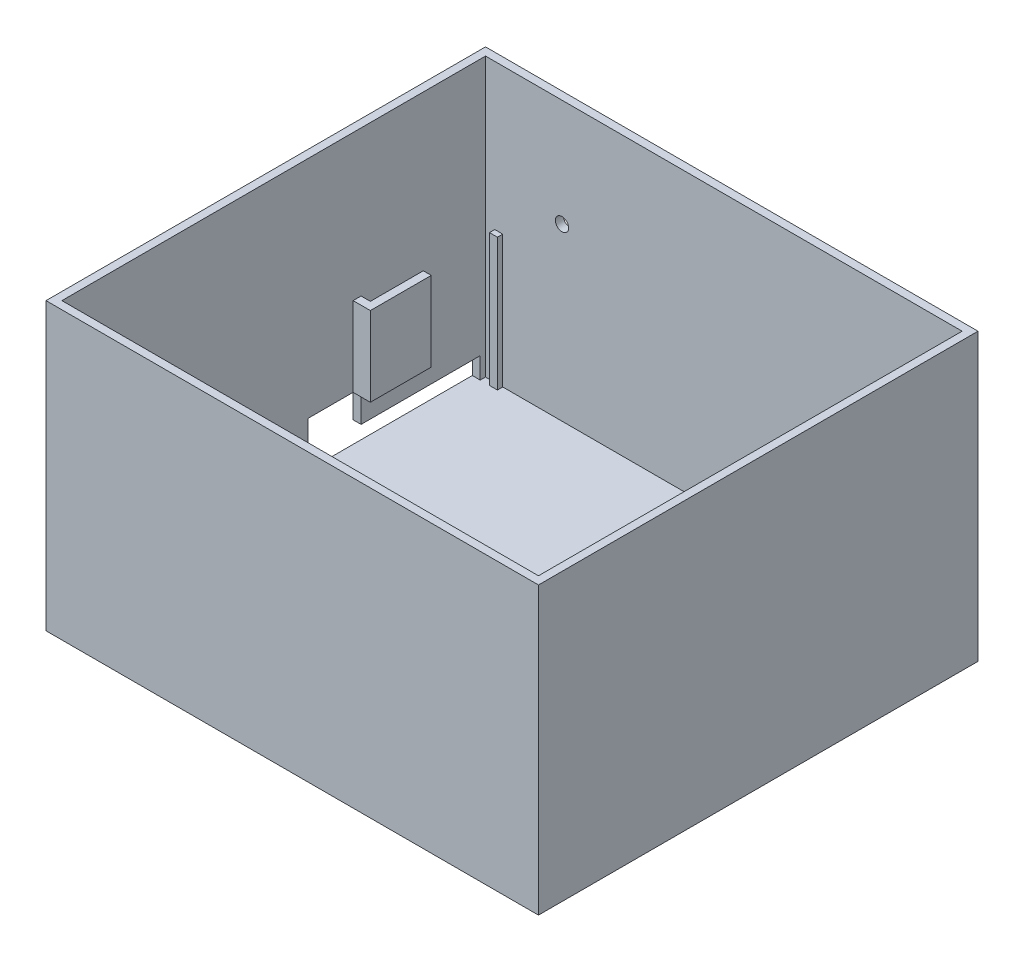
ISO-10303-21;
HEADER;
FILE_DESCRIPTION(('STEP AP214'),'2;1');
FILE_NAME('part.step','',(''),(''),'','','');
FILE_SCHEMA(('AUTOMOTIVE_DESIGN { 1 0 10303 214 1 1 1 1 }'));
ENDSEC;
DATA;
#1=APPLICATION_CONTEXT('core data for automotive mechanical design processes');
#2=APPLICATION_PROTOCOL_DEFINITION('international standard','automotive_design',2000,#1);
#3=PRODUCT_CONTEXT('',#1,'mechanical');
#4=PRODUCT('Part','Part','',(#3));
#5=PRODUCT_RELATED_PRODUCT_CATEGORY('part','',(#4));
#6=PRODUCT_DEFINITION_FORMATION('','',#4);
#7=PRODUCT_DEFINITION_CONTEXT('part definition',#1,'design');
#8=PRODUCT_DEFINITION('design','',#6,#7);
#9=PRODUCT_DEFINITION_SHAPE('','',#8);
#10=(LENGTH_UNIT() NAMED_UNIT(*) SI_UNIT(.MILLI.,.METRE.));
#11=(NAMED_UNIT(*) PLANE_ANGLE_UNIT() SI_UNIT($,.RADIAN.));
#12=(NAMED_UNIT(*) SI_UNIT($,.STERADIAN.) SOLID_ANGLE_UNIT());
#13=UNCERTAINTY_MEASURE_WITH_UNIT(LENGTH_MEASURE(1.E-05),#10,'distance_accuracy_value','');
#14=(GEOMETRIC_REPRESENTATION_CONTEXT(3) GLOBAL_UNCERTAINTY_ASSIGNED_CONTEXT((#13)) GLOBAL_UNIT_ASSIGNED_CONTEXT((#10,
#11,#12)) REPRESENTATION_CONTEXT('',''));
#15=CARTESIAN_POINT('',(0.,0.,0.));
#16=DIRECTION('',(0.,0.,1.));
#17=DIRECTION('',(1.,0.,0.));
#18=AXIS2_PLACEMENT_3D('',#15,#16,#17);
#19=CARTESIAN_POINT('',(-79.75,23.,-2.875));
#20=DIRECTION('',(0.,0.,1.));
#21=DIRECTION('',(1.,0.,0.));
#22=AXIS2_PLACEMENT_3D('',#19,#20,#21);
#23=PLANE('',#22);
#24=DIRECTION('',(0.,1.,0.));
#25=VECTOR('',#24,1.);
#26=CARTESIAN_POINT('',(-82.75,23.,-2.875));
#27=LINE('',#26,#25);
#28=CARTESIAN_POINT('',(-82.75,23.,-2.875));
#29=VERTEX_POINT('',#28);
#30=CARTESIAN_POINT('',(-82.75,53.,-2.875));
#31=VERTEX_POINT('',#30);
#32=EDGE_CURVE('E243',#29,#31,#27,.T.);
#33=ORIENTED_EDGE('',*,*,#32,.F.);
#34=DIRECTION('',(-1.,0.,0.));
#35=VECTOR('',#34,1.);
#36=CARTESIAN_POINT('',(-79.75,23.,-2.875));
#37=LINE('',#36,#35);
#38=CARTESIAN_POINT('',(-86.25,23.,-2.875));
#39=VERTEX_POINT('',#38);
#40=EDGE_CURVE('E266',#29,#39,#37,.T.);
#41=ORIENTED_EDGE('',*,*,#40,.T.);
#42=DIRECTION('',(0.,1.,0.));
#43=VECTOR('',#42,1.);
#44=CARTESIAN_POINT('',(-86.25,23.,-2.875));
#45=LINE('',#44,#43);
#46=CARTESIAN_POINT('',(-86.25,53.,-2.875));
#47=VERTEX_POINT('',#46);
#48=EDGE_CURVE('E248',#39,#47,#45,.T.);
#49=ORIENTED_EDGE('',*,*,#48,.T.);
#50=DIRECTION('',(-1.,0.,0.));
#51=VECTOR('',#50,1.);
#52=CARTESIAN_POINT('',(-79.75,53.,-2.875));
#53=LINE('',#52,#51);
#54=EDGE_CURVE('E56',#31,#47,#53,.T.);
#55=ORIENTED_EDGE('',*,*,#54,.F.);
#56=EDGE_LOOP('',(#33,#41,#49,#55));
#57=FACE_BOUND('',#56,.T.);
#58=ADVANCED_FACE('F39',(#57),#23,.F.);
#59=CARTESIAN_POINT('',(-86.25,108.,-49.875));
#60=DIRECTION('',(-1.,0.,0.));
#61=DIRECTION('',(0.,0.,1.));
#62=AXIS2_PLACEMENT_3D('',#59,#60,#61);
#63=PLANE('',#62);
#64=ORIENTED_EDGE('',*,*,#48,.F.);
#65=DIRECTION('',(0.,-1.,0.));
#66=VECTOR('',#65,1.);
#67=CARTESIAN_POINT('',(-86.25,2.99999999999999,-2.875));
#68=LINE('',#67,#66);
#69=CARTESIAN_POINT('',(-86.25,11.,-2.875));
#70=VERTEX_POINT('',#69);
#71=EDGE_CURVE('E285',#39,#70,#68,.T.);
#72=ORIENTED_EDGE('',*,*,#71,.T.);
#73=DIRECTION('',(0.,0.,1.));
#74=VECTOR('',#73,1.);
#75=CARTESIAN_POINT('',(-86.25,11.,-47.875));
#76=LINE('',#75,#74);
#77=CARTESIAN_POINT('',(-86.25,11.,-47.875));
#78=VERTEX_POINT('',#77);
#79=EDGE_CURVE('E360',#78,#70,#76,.T.);
#80=ORIENTED_EDGE('',*,*,#79,.F.);
#81=DIRECTION('',(0.,1.,0.));
#82=VECTOR('',#81,1.);
#83=CARTESIAN_POINT('',(-86.25,3.,-47.875));
#84=LINE('',#83,#82);
#85=CARTESIAN_POINT('',(-86.25,3.,-47.875));
#86=VERTEX_POINT('',#85);
#87=EDGE_CURVE('E354',#86,#78,#84,.T.);
#88=ORIENTED_EDGE('',*,*,#87,.F.);
#89=DIRECTION('',(0.,0.,-1.));
#90=VECTOR('',#89,1.);
#91=CARTESIAN_POINT('',(-86.25,3.,-49.875));
#92=LINE('',#91,#90);
#93=CARTESIAN_POINT('',(-86.25,3.,-49.875));
#94=VERTEX_POINT('',#93);
#95=EDGE_CURVE('E417',#86,#94,#92,.T.);
#96=ORIENTED_EDGE('',*,*,#95,.T.);
#97=DIRECTION('',(0.,-1.,0.));
#98=VECTOR('',#97,1.);
#99=CARTESIAN_POINT('',(-86.25,108.,-49.875));
#100=LINE('',#99,#98);
#101=CARTESIAN_POINT('',(-86.25,108.,-49.875));
#102=VERTEX_POINT('',#101);
#103=EDGE_CURVE('E422',#102,#94,#100,.T.);
#104=ORIENTED_EDGE('',*,*,#103,.F.);
#105=DIRECTION('',(0.,0.,-1.));
#106=VECTOR('',#105,1.);
#107=CARTESIAN_POINT('',(-86.25,108.,-49.875));
#108=LINE('',#107,#106);
#109=CARTESIAN_POINT('',(-86.25,108.,110.125));
#110=VERTEX_POINT('',#109);
#111=EDGE_CURVE('E418',#110,#102,#108,.T.);
#112=ORIENTED_EDGE('',*,*,#111,.F.);
#113=DIRECTION('',(0.,-1.,0.));
#114=VECTOR('',#113,1.);
#115=CARTESIAN_POINT('',(-86.25,108.,110.125));
#116=LINE('',#115,#114);
#117=CARTESIAN_POINT('',(-86.25,3.,110.125));
#118=VERTEX_POINT('',#117);
#119=EDGE_CURVE('E431',#110,#118,#116,.T.);
#120=ORIENTED_EDGE('',*,*,#119,.T.);
#121=CARTESIAN_POINT('',(-86.25,3.,54.125));
#122=VERTEX_POINT('',#121);
#123=EDGE_CURVE('E423',#118,#122,#92,.T.);
#124=ORIENTED_EDGE('',*,*,#123,.T.);
#125=DIRECTION('',(0.,-1.,0.));
#126=VECTOR('',#125,1.);
#127=CARTESIAN_POINT('',(-86.25,23.,54.125));
#128=LINE('',#127,#126);
#129=CARTESIAN_POINT('',(-86.25,23.,54.125));
#130=VERTEX_POINT('',#129);
#131=EDGE_CURVE('E414',#130,#122,#128,.T.);
#132=ORIENTED_EDGE('',*,*,#131,.F.);
#133=DIRECTION('',(0.,0.,1.));
#134=VECTOR('',#133,1.);
#135=CARTESIAN_POINT('',(-86.25,23.,51.125));
#136=LINE('',#135,#134);
#137=CARTESIAN_POINT('',(-86.25,23.,51.125));
#138=VERTEX_POINT('',#137);
#139=EDGE_CURVE('E384',#138,#130,#136,.T.);
#140=ORIENTED_EDGE('',*,*,#139,.F.);
#141=DIRECTION('',(0.,-1.,0.));
#142=VECTOR('',#141,1.);
#143=CARTESIAN_POINT('',(-86.25,23.,51.125));
#144=LINE('',#143,#142);
#145=CARTESIAN_POINT('',(-86.25,3.,51.125));
#146=VERTEX_POINT('',#145);
#147=EDGE_CURVE('E399',#138,#146,#144,.T.);
#148=ORIENTED_EDGE('',*,*,#147,.T.);
#149=CARTESIAN_POINT('',(-86.25,2.99999999999999,17.125));
#150=VERTEX_POINT('',#149);
#151=EDGE_CURVE('E427',#146,#150,#92,.T.);
#152=ORIENTED_EDGE('',*,*,#151,.T.);
#153=DIRECTION('',(0.,1.,0.));
#154=VECTOR('',#153,1.);
#155=CARTESIAN_POINT('',(-86.25,2.99999999999999,17.125));
#156=LINE('',#155,#154);
#157=CARTESIAN_POINT('',(-86.25,23.,17.125));
#158=VERTEX_POINT('',#157);
#159=EDGE_CURVE('E289',#150,#158,#156,.T.);
#160=ORIENTED_EDGE('',*,*,#159,.T.);
#161=DIRECTION('',(0.,0.,-1.));
#162=VECTOR('',#161,1.);
#163=CARTESIAN_POINT('',(-86.25,23.,-2.875));
#164=LINE('',#163,#162);
#165=CARTESIAN_POINT('',(-86.25,23.,0.124999999999998));
#166=VERTEX_POINT('',#165);
#167=EDGE_CURVE('E294',#158,#166,#164,.T.);
#168=ORIENTED_EDGE('',*,*,#167,.T.);
#169=DIRECTION('',(0.,-1.,0.));
#170=VECTOR('',#169,1.);
#171=CARTESIAN_POINT('',(-86.25,23.,0.124999999999998));
#172=LINE('',#171,#170);
#173=CARTESIAN_POINT('',(-86.25,53.,0.125));
#174=VERTEX_POINT('',#173);
#175=EDGE_CURVE('E63',#174,#166,#172,.T.);
#176=ORIENTED_EDGE('',*,*,#175,.F.);
#177=DIRECTION('',(0.,0.,1.));
#178=VECTOR('',#177,1.);
#179=CARTESIAN_POINT('',(-86.25,53.,-2.875));
#180=LINE('',#179,#178);
#181=EDGE_CURVE('E254',#47,#174,#180,.T.);
#182=ORIENTED_EDGE('',*,*,#181,.F.);
#183=EDGE_LOOP('',(#64,#72,#80,#88,#96,#104,#112,#120,#124,#132,#140,#148,#152,#160,#168,#176,#182));
#184=FACE_BOUND('',#183,.T.);
#185=ADVANCED_FACE('F532',(#184),#63,.F.);
#186=CARTESIAN_POINT('',(0.,3.,0.));
#187=DIRECTION('',(0.,1.,0.));
#188=DIRECTION('',(0.,0.,1.));
#189=AXIS2_PLACEMENT_3D('',#186,#187,#188);
#190=PLANE('',#189);
#191=DIRECTION('',(-1.,0.,0.));
#192=VECTOR('',#191,1.);
#193=CARTESIAN_POINT('',(-86.25,2.99999999999999,17.125));
#194=LINE('',#193,#192);
#195=CARTESIAN_POINT('',(-89.25,2.99999999999999,17.125));
#196=VERTEX_POINT('',#195);
#197=EDGE_CURVE('E297',#150,#196,#194,.T.);
#198=ORIENTED_EDGE('',*,*,#197,.F.);
#199=ORIENTED_EDGE('',*,*,#151,.F.);
#200=DIRECTION('',(-1.,0.,0.));
#201=VECTOR('',#200,1.);
#202=CARTESIAN_POINT('',(-86.25,3.,51.125));
#203=LINE('',#202,#201);
#204=CARTESIAN_POINT('',(93.7499999999999,3.,51.125));
#205=VERTEX_POINT('',#204);
#206=EDGE_CURVE('E389',#205,#146,#203,.T.);
#207=ORIENTED_EDGE('',*,*,#206,.F.);
#208=DIRECTION('',(0.,0.,1.));
#209=VECTOR('',#208,1.);
#210=CARTESIAN_POINT('',(93.75,3.,-49.875));
#211=LINE('',#210,#209);
#212=CARTESIAN_POINT('',(93.7499999999999,3.,-49.875));
#213=VERTEX_POINT('',#212);
#214=EDGE_CURVE('E452',#213,#205,#211,.T.);
#215=ORIENTED_EDGE('',*,*,#214,.F.);
#216=DIRECTION('',(1.,0.,0.));
#217=VECTOR('',#216,1.);
#218=CARTESIAN_POINT('',(-89.25,3.,-49.875));
#219=LINE('',#218,#217);
#220=CARTESIAN_POINT('',(-79.75,3.,-49.875));
#221=VERTEX_POINT('',#220);
#222=EDGE_CURVE('E434',#221,#213,#219,.T.);
#223=ORIENTED_EDGE('',*,*,#222,.F.);
#224=DIRECTION('',(0.,0.,-1.));
#225=VECTOR('',#224,1.);
#226=CARTESIAN_POINT('',(-79.75,3.,-49.875));
#227=LINE('',#226,#225);
#228=CARTESIAN_POINT('',(-79.75,3.,-47.875));
#229=VERTEX_POINT('',#228);
#230=EDGE_CURVE('E322',#229,#221,#227,.T.);
#231=ORIENTED_EDGE('',*,*,#230,.F.);
#232=DIRECTION('',(1.,0.,0.));
#233=VECTOR('',#232,1.);
#234=CARTESIAN_POINT('',(-82.75,3.,-47.875));
#235=LINE('',#234,#233);
#236=CARTESIAN_POINT('',(-82.75,3.,-47.875));
#237=VERTEX_POINT('',#236);
#238=EDGE_CURVE('E336',#237,#229,#235,.T.);
#239=ORIENTED_EDGE('',*,*,#238,.F.);
#240=DIRECTION('',(0.,0.,1.));
#241=VECTOR('',#240,1.);
#242=CARTESIAN_POINT('',(-82.75,3.,-49.875));
#243=LINE('',#242,#241);
#244=CARTESIAN_POINT('',(-82.75,3.,-49.875));
#245=VERTEX_POINT('',#244);
#246=EDGE_CURVE('E310',#245,#237,#243,.T.);
#247=ORIENTED_EDGE('',*,*,#246,.F.);
#248=EDGE_CURVE('E439',#94,#245,#219,.T.);
#249=ORIENTED_EDGE('',*,*,#248,.F.);
#250=ORIENTED_EDGE('',*,*,#95,.F.);
#251=DIRECTION('',(1.,0.,0.));
#252=VECTOR('',#251,1.);
#253=CARTESIAN_POINT('',(-89.25,3.,-47.875));
#254=LINE('',#253,#252);
#255=CARTESIAN_POINT('',(-89.25,3.,-47.875));
#256=VERTEX_POINT('',#255);
#257=EDGE_CURVE('E374',#256,#86,#254,.T.);
#258=ORIENTED_EDGE('',*,*,#257,.F.);
#259=DIRECTION('',(0.,0.,-1.));
#260=VECTOR('',#259,1.);
#261=CARTESIAN_POINT('',(-89.25,3.,-47.875));
#262=LINE('',#261,#260);
#263=EDGE_CURVE('E364',#196,#256,#262,.T.);
#264=ORIENTED_EDGE('',*,*,#263,.F.);
#265=EDGE_LOOP('',(#198,#199,#207,#215,#223,#231,#239,#247,#249,#250,#258,#264));
#266=FACE_BOUND('',#265,.T.);
#267=ADVANCED_FACE('F538',(#266),#190,.T.);
#268=CARTESIAN_POINT('',(-89.25,108.,-49.875));
#269=DIRECTION('',(0.,0.,-1.));
#270=DIRECTION('',(-1.,0.,0.));
#271=AXIS2_PLACEMENT_3D('',#268,#269,#270);
#272=PLANE('',#271);
#273=CARTESIAN_POINT('',(-57.3658746621959,67.44295955,-49.875));
#274=DIRECTION('',(0.,0.,1.));
#275=DIRECTION('',(1.,0.,0.));
#276=AXIS2_PLACEMENT_3D('',#273,#274,#275);
#277=CIRCLE('',#276,2.5);
#278=CARTESIAN_POINT('',(-54.8658746621959,67.44295955,-49.875));
#279=VERTEX_POINT('',#278);
#280=EDGE_CURVE('E619',#279,#279,#277,.T.);
#281=ORIENTED_EDGE('',*,*,#280,.F.);
#282=EDGE_LOOP('',(#281));
#283=FACE_BOUND('',#282,.T.);
#284=DIRECTION('',(0.,-1.,0.));
#285=VECTOR('',#284,1.);
#286=CARTESIAN_POINT('',(-82.75,53.,-49.875));
#287=LINE('',#286,#285);
#288=CARTESIAN_POINT('',(-82.75,53.,-49.875));
#289=VERTEX_POINT('',#288);
#290=EDGE_CURVE('E332',#289,#245,#287,.T.);
#291=ORIENTED_EDGE('',*,*,#290,.F.);
#292=DIRECTION('',(-1.,0.,0.));
#293=VECTOR('',#292,1.);
#294=CARTESIAN_POINT('',(-82.75,53.,-49.875));
#295=LINE('',#294,#293);
#296=CARTESIAN_POINT('',(-79.75,53.,-49.875));
#297=VERTEX_POINT('',#296);
#298=EDGE_CURVE('E329',#297,#289,#295,.T.);
#299=ORIENTED_EDGE('',*,*,#298,.F.);
#300=DIRECTION('',(0.,-1.,0.));
#301=VECTOR('',#300,1.);
#302=CARTESIAN_POINT('',(-79.75,53.,-49.875));
#303=LINE('',#302,#301);
#304=EDGE_CURVE('E343',#297,#221,#303,.T.);
#305=ORIENTED_EDGE('',*,*,#304,.T.);
#306=ORIENTED_EDGE('',*,*,#222,.T.);
#307=DIRECTION('',(0.,-1.,0.));
#308=VECTOR('',#307,1.);
#309=CARTESIAN_POINT('',(93.75,108.,-49.875));
#310=LINE('',#309,#308);
#311=CARTESIAN_POINT('',(93.75,108.,-49.875));
#312=VERTEX_POINT('',#311);
#313=EDGE_CURVE('E455',#312,#213,#310,.T.);
#314=ORIENTED_EDGE('',*,*,#313,.F.);
#315=DIRECTION('',(1.,0.,0.));
#316=VECTOR('',#315,1.);
#317=CARTESIAN_POINT('',(-89.25,108.,-49.875));
#318=LINE('',#317,#316);
#319=EDGE_CURVE('E435',#102,#312,#318,.T.);
#320=ORIENTED_EDGE('',*,*,#319,.F.);
#321=ORIENTED_EDGE('',*,*,#103,.T.);
#322=ORIENTED_EDGE('',*,*,#248,.T.);
#323=EDGE_LOOP('',(#291,#299,#305,#306,#314,#320,#321,#322));
#324=FACE_BOUND('',#323,.T.);
#325=ADVANCED_FACE('F591',(#283,#324),#272,.F.);
#326=CARTESIAN_POINT('',(93.7499999999999,3.,54.125));
#327=VERTEX_POINT('',#326);
#328=CARTESIAN_POINT('',(93.75,3.,110.125));
#329=VERTEX_POINT('',#328);
#330=EDGE_CURVE('E443',#327,#329,#211,.T.);
#331=ORIENTED_EDGE('',*,*,#330,.F.);
#332=DIRECTION('',(1.,0.,0.));
#333=VECTOR('',#332,1.);
#334=CARTESIAN_POINT('',(-86.25,3.,54.125));
#335=LINE('',#334,#333);
#336=EDGE_CURVE('E377',#122,#327,#335,.T.);
#337=ORIENTED_EDGE('',*,*,#336,.F.);
#338=ORIENTED_EDGE('',*,*,#123,.F.);
#339=DIRECTION('',(-1.,0.,0.));
#340=VECTOR('',#339,1.);
#341=CARTESIAN_POINT('',(-89.25,3.,110.125));
#342=LINE('',#341,#340);
#343=EDGE_CURVE('E462',#329,#118,#342,.T.);
#344=ORIENTED_EDGE('',*,*,#343,.F.);
#345=EDGE_LOOP('',(#331,#337,#338,#344));
#346=FACE_BOUND('',#345,.T.);
#347=ADVANCED_FACE('F594',(#346),#190,.T.);
#348=CARTESIAN_POINT('',(93.75,108.,-49.875));
#349=DIRECTION('',(1.,0.,0.));
#350=DIRECTION('',(0.,0.,-1.));
#351=AXIS2_PLACEMENT_3D('',#348,#349,#350);
#352=PLANE('',#351);
#353=DIRECTION('',(0.,-1.,0.));
#354=VECTOR('',#353,1.);
#355=CARTESIAN_POINT('',(93.7499999999999,23.,54.125));
#356=LINE('',#355,#354);
#357=CARTESIAN_POINT('',(93.7499999999999,23.,54.125));
#358=VERTEX_POINT('',#357);
#359=EDGE_CURVE('E410',#358,#327,#356,.T.);
#360=ORIENTED_EDGE('',*,*,#359,.T.);
#361=ORIENTED_EDGE('',*,*,#330,.T.);
#362=DIRECTION('',(0.,-1.,0.));
#363=VECTOR('',#362,1.);
#364=CARTESIAN_POINT('',(93.75,108.,110.125));
#365=LINE('',#364,#363);
#366=CARTESIAN_POINT('',(93.75,108.,110.125));
#367=VERTEX_POINT('',#366);
#368=EDGE_CURVE('E475',#367,#329,#365,.T.);
#369=ORIENTED_EDGE('',*,*,#368,.F.);
#370=DIRECTION('',(0.,0.,1.));
#371=VECTOR('',#370,1.);
#372=CARTESIAN_POINT('',(93.75,108.,-49.875));
#373=LINE('',#372,#371);
#374=EDGE_CURVE('E451',#312,#367,#373,.T.);
#375=ORIENTED_EDGE('',*,*,#374,.F.);
#376=ORIENTED_EDGE('',*,*,#313,.T.);
#377=ORIENTED_EDGE('',*,*,#214,.T.);
#378=DIRECTION('',(0.,-1.,0.));
#379=VECTOR('',#378,1.);
#380=CARTESIAN_POINT('',(93.7499999999999,23.,51.125));
#381=LINE('',#380,#379);
#382=CARTESIAN_POINT('',(93.7499999999999,23.,51.125));
#383=VERTEX_POINT('',#382);
#384=EDGE_CURVE('E407',#383,#205,#381,.T.);
#385=ORIENTED_EDGE('',*,*,#384,.F.);
#386=DIRECTION('',(0.,0.,-1.));
#387=VECTOR('',#386,1.);
#388=CARTESIAN_POINT('',(93.7499999999999,23.,51.125));
#389=LINE('',#388,#387);
#390=EDGE_CURVE('E392',#358,#383,#389,.T.);
#391=ORIENTED_EDGE('',*,*,#390,.F.);
#392=EDGE_LOOP('',(#360,#361,#369,#375,#376,#377,#385,#391));
#393=FACE_BOUND('',#392,.T.);
#394=ADVANCED_FACE('F596',(#393),#352,.F.);
#395=CARTESIAN_POINT('',(-89.25,108.,110.125));
#396=DIRECTION('',(0.,0.,1.));
#397=DIRECTION('',(1.,0.,0.));
#398=AXIS2_PLACEMENT_3D('',#395,#396,#397);
#399=PLANE('',#398);
#400=ORIENTED_EDGE('',*,*,#119,.F.);
#401=DIRECTION('',(-1.,0.,0.));
#402=VECTOR('',#401,1.);
#403=CARTESIAN_POINT('',(-89.25,108.,110.125));
#404=LINE('',#403,#402);
#405=EDGE_CURVE('E471',#367,#110,#404,.T.);
#406=ORIENTED_EDGE('',*,*,#405,.F.);
#407=ORIENTED_EDGE('',*,*,#368,.T.);
#408=ORIENTED_EDGE('',*,*,#343,.T.);
#409=EDGE_LOOP('',(#400,#406,#407,#408));
#410=FACE_BOUND('',#409,.T.);
#411=ADVANCED_FACE('F529',(#410),#399,.F.);
#412=CARTESIAN_POINT('',(-89.25,3.,-52.875));
#413=DIRECTION('',(1.,0.,0.));
#414=DIRECTION('',(0.,0.,-1.));
#415=AXIS2_PLACEMENT_3D('',#412,#413,#414);
#416=PLANE('',#415);
#417=DIRECTION('',(0.,0.,1.));
#418=VECTOR('',#417,1.);
#419=CARTESIAN_POINT('',(-89.25,11.,-47.875));
#420=LINE('',#419,#418);
#421=CARTESIAN_POINT('',(-89.25,11.,-47.875));
#422=VERTEX_POINT('',#421);
#423=CARTESIAN_POINT('',(-89.25,11.,-2.875));
#424=VERTEX_POINT('',#423);
#425=EDGE_CURVE('E359',#422,#424,#420,.T.);
#426=ORIENTED_EDGE('',*,*,#425,.T.);
#427=DIRECTION('',(0.,-1.,0.));
#428=VECTOR('',#427,1.);
#429=CARTESIAN_POINT('',(-89.25,2.99999999999999,-2.875));
#430=LINE('',#429,#428);
#431=CARTESIAN_POINT('',(-89.25,23.,-2.875));
#432=VERTEX_POINT('',#431);
#433=EDGE_CURVE('E284',#432,#424,#430,.T.);
#434=ORIENTED_EDGE('',*,*,#433,.F.);
#435=DIRECTION('',(0.,0.,-1.));
#436=VECTOR('',#435,1.);
#437=CARTESIAN_POINT('',(-89.25,23.,-2.875));
#438=LINE('',#437,#436);
#439=CARTESIAN_POINT('',(-89.25,23.,17.125));
#440=VERTEX_POINT('',#439);
#441=EDGE_CURVE('E290',#440,#432,#438,.T.);
#442=ORIENTED_EDGE('',*,*,#441,.F.);
#443=DIRECTION('',(0.,1.,0.));
#444=VECTOR('',#443,1.);
#445=CARTESIAN_POINT('',(-89.25,2.99999999999999,17.125));
#446=LINE('',#445,#444);
#447=EDGE_CURVE('E300',#196,#440,#446,.T.);
#448=ORIENTED_EDGE('',*,*,#447,.F.);
#449=ORIENTED_EDGE('',*,*,#263,.T.);
#450=DIRECTION('',(0.,1.,0.));
#451=VECTOR('',#450,1.);
#452=CARTESIAN_POINT('',(-89.25,3.,-47.875));
#453=LINE('',#452,#451);
#454=EDGE_CURVE('E355',#256,#422,#453,.T.);
#455=ORIENTED_EDGE('',*,*,#454,.T.);
#456=EDGE_LOOP('',(#426,#434,#442,#448,#449,#455));
#457=FACE_BOUND('',#456,.T.);
#458=DIRECTION('',(0.,0.,1.));
#459=VECTOR('',#458,1.);
#460=CARTESIAN_POINT('',(-89.25,0.,-52.875));
#461=LINE('',#460,#459);
#462=CARTESIAN_POINT('',(-89.25,0.,-52.875));
#463=VERTEX_POINT('',#462);
#464=CARTESIAN_POINT('',(-89.25,0.,113.125));
#465=VERTEX_POINT('',#464);
#466=EDGE_CURVE('E482',#463,#465,#461,.T.);
#467=ORIENTED_EDGE('',*,*,#466,.T.);
#468=DIRECTION('',(0.,-1.,0.));
#469=VECTOR('',#468,1.);
#470=CARTESIAN_POINT('',(-89.25,3.,113.125));
#471=LINE('',#470,#469);
#472=CARTESIAN_POINT('',(-89.25,108.,113.125));
#473=VERTEX_POINT('',#472);
#474=EDGE_CURVE('E11',#473,#465,#471,.T.);
#475=ORIENTED_EDGE('',*,*,#474,.F.);
#476=DIRECTION('',(0.,0.,1.));
#477=VECTOR('',#476,1.);
#478=CARTESIAN_POINT('',(-89.25,108.,110.125));
#479=LINE('',#478,#477);
#480=CARTESIAN_POINT('',(-89.25,108.,-52.875));
#481=VERTEX_POINT('',#480);
#482=EDGE_CURVE('E463',#481,#473,#479,.T.);
#483=ORIENTED_EDGE('',*,*,#482,.F.);
#484=DIRECTION('',(0.,-1.,0.));
#485=VECTOR('',#484,1.);
#486=CARTESIAN_POINT('',(-89.25,3.,-52.875));
#487=LINE('',#486,#485);
#488=EDGE_CURVE('E495',#481,#463,#487,.T.);
#489=ORIENTED_EDGE('',*,*,#488,.T.);
#490=EDGE_LOOP('',(#467,#475,#483,#489));
#491=FACE_BOUND('',#490,.T.);
#492=ADVANCED_FACE('F41',(#457,#491),#416,.F.);
#493=CARTESIAN_POINT('',(-89.25,3.,113.125));
#494=DIRECTION('',(0.,0.,-1.));
#495=DIRECTION('',(-1.,0.,0.));
#496=AXIS2_PLACEMENT_3D('',#493,#494,#495);
#497=PLANE('',#496);
#498=DIRECTION('',(0.,-1.,0.));
#499=VECTOR('',#498,1.);
#500=CARTESIAN_POINT('',(96.75,3.,113.125));
#501=LINE('',#500,#499);
#502=CARTESIAN_POINT('',(96.75,108.,113.125));
#503=VERTEX_POINT('',#502);
#504=CARTESIAN_POINT('',(96.75,0.,113.125));
#505=VERTEX_POINT('',#504);
#506=EDGE_CURVE('E49',#503,#505,#501,.T.);
#507=ORIENTED_EDGE('',*,*,#506,.F.);
#508=DIRECTION('',(1.,0.,0.));
#509=VECTOR('',#508,1.);
#510=CARTESIAN_POINT('',(-89.25,108.,113.125));
#511=LINE('',#510,#509);
#512=EDGE_CURVE('E467',#473,#503,#511,.T.);
#513=ORIENTED_EDGE('',*,*,#512,.F.);
#514=ORIENTED_EDGE('',*,*,#474,.T.);
#515=DIRECTION('',(1.,0.,0.));
#516=VECTOR('',#515,1.);
#517=CARTESIAN_POINT('',(-89.25,0.,113.125));
#518=LINE('',#517,#516);
#519=EDGE_CURVE('E486',#465,#505,#518,.T.);
#520=ORIENTED_EDGE('',*,*,#519,.T.);
#521=EDGE_LOOP('',(#507,#513,#514,#520));
#522=FACE_BOUND('',#521,.T.);
#523=ADVANCED_FACE('F522',(#522),#497,.F.);
#524=CARTESIAN_POINT('',(96.75,3.,-52.875));
#525=DIRECTION('',(-1.,0.,0.));
#526=DIRECTION('',(0.,0.,1.));
#527=AXIS2_PLACEMENT_3D('',#524,#525,#526);
#528=PLANE('',#527);
#529=DIRECTION('',(0.,-1.,0.));
#530=VECTOR('',#529,1.);
#531=CARTESIAN_POINT('',(96.75,3.,-52.875));
#532=LINE('',#531,#530);
#533=CARTESIAN_POINT('',(96.75,108.,-52.875));
#534=VERTEX_POINT('',#533);
#535=CARTESIAN_POINT('',(96.75,0.,-52.875));
#536=VERTEX_POINT('',#535);
#537=EDGE_CURVE('E499',#534,#536,#532,.T.);
#538=ORIENTED_EDGE('',*,*,#537,.F.);
#539=DIRECTION('',(0.,0.,-1.));
#540=VECTOR('',#539,1.);
#541=CARTESIAN_POINT('',(96.75,108.,-49.875));
#542=LINE('',#541,#540);
#543=EDGE_CURVE('E447',#503,#534,#542,.T.);
#544=ORIENTED_EDGE('',*,*,#543,.F.);
#545=ORIENTED_EDGE('',*,*,#506,.T.);
#546=DIRECTION('',(0.,0.,-1.));
#547=VECTOR('',#546,1.);
#548=CARTESIAN_POINT('',(96.75,0.,-52.875));
#549=LINE('',#548,#547);
#550=EDGE_CURVE('E489',#505,#536,#549,.T.);
#551=ORIENTED_EDGE('',*,*,#550,.T.);
#552=EDGE_LOOP('',(#538,#544,#545,#551));
#553=FACE_BOUND('',#552,.T.);
#554=ADVANCED_FACE('F508',(#553),#528,.F.);
#555=CARTESIAN_POINT('',(-89.25,3.,-52.875));
#556=DIRECTION('',(0.,0.,1.));
#557=DIRECTION('',(1.,0.,0.));
#558=AXIS2_PLACEMENT_3D('',#555,#556,#557);
#559=PLANE('',#558);
#560=CARTESIAN_POINT('',(-57.3658746621959,67.44295955,-52.875));
#561=DIRECTION('',(0.,0.,1.));
#562=DIRECTION('',(1.,0.,0.));
#563=AXIS2_PLACEMENT_3D('',#560,#561,#562);
#564=CIRCLE('',#563,2.5);
#565=CARTESIAN_POINT('',(-54.8658746621959,67.44295955,-52.875));
#566=VERTEX_POINT('',#565);
#567=EDGE_CURVE('E43',#566,#566,#564,.T.);
#568=ORIENTED_EDGE('',*,*,#567,.T.);
#569=EDGE_LOOP('',(#568));
#570=FACE_BOUND('',#569,.T.);
#571=DIRECTION('',(-1.,0.,0.));
#572=VECTOR('',#571,1.);
#573=CARTESIAN_POINT('',(-89.25,0.,-52.875));
#574=LINE('',#573,#572);
#575=EDGE_CURVE('E492',#536,#463,#574,.T.);
#576=ORIENTED_EDGE('',*,*,#575,.T.);
#577=ORIENTED_EDGE('',*,*,#488,.F.);
#578=DIRECTION('',(-1.,0.,0.));
#579=VECTOR('',#578,1.);
#580=CARTESIAN_POINT('',(-89.25,108.,-52.875));
#581=LINE('',#580,#579);
#582=EDGE_CURVE('E438',#534,#481,#581,.T.);
#583=ORIENTED_EDGE('',*,*,#582,.F.);
#584=ORIENTED_EDGE('',*,*,#537,.T.);
#585=EDGE_LOOP('',(#576,#577,#583,#584));
#586=FACE_BOUND('',#585,.T.);
#587=ADVANCED_FACE('F517',(#570,#586),#559,.F.);
#588=CARTESIAN_POINT('',(0.,0.,0.));
#589=DIRECTION('',(0.,1.,0.));
#590=DIRECTION('',(0.,0.,1.));
#591=AXIS2_PLACEMENT_3D('',#588,#589,#590);
#592=PLANE('',#591);
#593=ORIENTED_EDGE('',*,*,#466,.F.);
#594=ORIENTED_EDGE('',*,*,#575,.F.);
#595=ORIENTED_EDGE('',*,*,#550,.F.);
#596=ORIENTED_EDGE('',*,*,#519,.F.);
#597=EDGE_LOOP('',(#593,#594,#595,#596));
#598=FACE_BOUND('',#597,.T.);
#599=ADVANCED_FACE('F514',(#598),#592,.F.);
#600=CARTESIAN_POINT('',(0.,108.,0.));
#601=DIRECTION('',(0.,1.,0.));
#602=DIRECTION('',(0.,0.,1.));
#603=AXIS2_PLACEMENT_3D('',#600,#601,#602);
#604=PLANE('',#603);
#605=ORIENTED_EDGE('',*,*,#405,.T.);
#606=ORIENTED_EDGE('',*,*,#111,.T.);
#607=ORIENTED_EDGE('',*,*,#319,.T.);
#608=ORIENTED_EDGE('',*,*,#374,.T.);
#609=EDGE_LOOP('',(#605,#606,#607,#608));
#610=FACE_BOUND('',#609,.T.);
#611=ORIENTED_EDGE('',*,*,#482,.T.);
#612=ORIENTED_EDGE('',*,*,#512,.T.);
#613=ORIENTED_EDGE('',*,*,#543,.T.);
#614=ORIENTED_EDGE('',*,*,#582,.T.);
#615=EDGE_LOOP('',(#611,#612,#613,#614));
#616=FACE_BOUND('',#615,.T.);
#617=ADVANCED_FACE('F521',(#610,#616),#604,.T.);
#618=CARTESIAN_POINT('',(-86.25,23.,54.125));
#619=DIRECTION('',(0.,0.,-1.));
#620=DIRECTION('',(-1.,0.,0.));
#621=AXIS2_PLACEMENT_3D('',#618,#619,#620);
#622=PLANE('',#621);
#623=ORIENTED_EDGE('',*,*,#336,.T.);
#624=ORIENTED_EDGE('',*,*,#359,.F.);
#625=DIRECTION('',(1.,0.,0.));
#626=VECTOR('',#625,1.);
#627=CARTESIAN_POINT('',(-86.25,23.,54.125));
#628=LINE('',#627,#626);
#629=EDGE_CURVE('E388',#130,#358,#628,.T.);
#630=ORIENTED_EDGE('',*,*,#629,.F.);
#631=ORIENTED_EDGE('',*,*,#131,.T.);
#632=EDGE_LOOP('',(#623,#624,#630,#631));
#633=FACE_BOUND('',#632,.T.);
#634=ADVANCED_FACE('F586',(#633),#622,.F.);
#635=CARTESIAN_POINT('',(-86.25,23.,51.125));
#636=DIRECTION('',(0.,0.,1.));
#637=DIRECTION('',(1.,0.,0.));
#638=AXIS2_PLACEMENT_3D('',#635,#636,#637);
#639=PLANE('',#638);
#640=ORIENTED_EDGE('',*,*,#206,.T.);
#641=ORIENTED_EDGE('',*,*,#147,.F.);
#642=DIRECTION('',(-1.,0.,0.));
#643=VECTOR('',#642,1.);
#644=CARTESIAN_POINT('',(-86.25,23.,51.125));
#645=LINE('',#644,#643);
#646=EDGE_CURVE('E395',#383,#138,#645,.T.);
#647=ORIENTED_EDGE('',*,*,#646,.F.);
#648=ORIENTED_EDGE('',*,*,#384,.T.);
#649=EDGE_LOOP('',(#640,#641,#647,#648));
#650=FACE_BOUND('',#649,.T.);
#651=ADVANCED_FACE('F582',(#650),#639,.F.);
#652=CARTESIAN_POINT('',(0.,23.,0.));
#653=DIRECTION('',(0.,1.,0.));
#654=DIRECTION('',(0.,0.,1.));
#655=AXIS2_PLACEMENT_3D('',#652,#653,#654);
#656=PLANE('',#655);
#657=ORIENTED_EDGE('',*,*,#139,.T.);
#658=ORIENTED_EDGE('',*,*,#629,.T.);
#659=ORIENTED_EDGE('',*,*,#390,.T.);
#660=ORIENTED_EDGE('',*,*,#646,.T.);
#661=EDGE_LOOP('',(#657,#658,#659,#660));
#662=FACE_BOUND('',#661,.T.);
#663=ADVANCED_FACE('F578',(#662),#656,.T.);
#664=CARTESIAN_POINT('',(-89.25,3.,-47.875));
#665=DIRECTION('',(0.,0.,-1.));
#666=DIRECTION('',(-1.,0.,0.));
#667=AXIS2_PLACEMENT_3D('',#664,#665,#666);
#668=PLANE('',#667);
#669=ORIENTED_EDGE('',*,*,#87,.T.);
#670=DIRECTION('',(1.,0.,0.));
#671=VECTOR('',#670,1.);
#672=CARTESIAN_POINT('',(-89.25,11.,-47.875));
#673=LINE('',#672,#671);
#674=EDGE_CURVE('E368',#422,#78,#673,.T.);
#675=ORIENTED_EDGE('',*,*,#674,.F.);
#676=ORIENTED_EDGE('',*,*,#454,.F.);
#677=ORIENTED_EDGE('',*,*,#257,.T.);
#678=EDGE_LOOP('',(#669,#675,#676,#677));
#679=FACE_BOUND('',#678,.T.);
#680=ADVANCED_FACE('F574',(#679),#668,.F.);
#681=CARTESIAN_POINT('',(-89.25,11.,-47.875));
#682=DIRECTION('',(0.,1.,0.));
#683=DIRECTION('',(0.,0.,1.));
#684=AXIS2_PLACEMENT_3D('',#681,#682,#683);
#685=PLANE('',#684);
#686=ORIENTED_EDGE('',*,*,#79,.T.);
#687=DIRECTION('',(1.,0.,0.));
#688=VECTOR('',#687,1.);
#689=CARTESIAN_POINT('',(-89.25,11.,-2.875));
#690=LINE('',#689,#688);
#691=EDGE_CURVE('E378',#424,#70,#690,.T.);
#692=ORIENTED_EDGE('',*,*,#691,.F.);
#693=ORIENTED_EDGE('',*,*,#425,.F.);
#694=ORIENTED_EDGE('',*,*,#674,.T.);
#695=EDGE_LOOP('',(#686,#692,#693,#694));
#696=FACE_BOUND('',#695,.T.);
#697=ADVANCED_FACE('F570',(#696),#685,.F.);
#698=CARTESIAN_POINT('',(-82.75,53.,-49.875));
#699=DIRECTION('',(1.,0.,0.));
#700=DIRECTION('',(0.,0.,-1.));
#701=AXIS2_PLACEMENT_3D('',#698,#699,#700);
#702=PLANE('',#701);
#703=ORIENTED_EDGE('',*,*,#246,.T.);
#704=DIRECTION('',(0.,-1.,0.));
#705=VECTOR('',#704,1.);
#706=CARTESIAN_POINT('',(-82.75,53.,-47.875));
#707=LINE('',#706,#705);
#708=CARTESIAN_POINT('',(-82.75,53.,-47.875));
#709=VERTEX_POINT('',#708);
#710=EDGE_CURVE('E351',#709,#237,#707,.T.);
#711=ORIENTED_EDGE('',*,*,#710,.F.);
#712=DIRECTION('',(0.,0.,1.));
#713=VECTOR('',#712,1.);
#714=CARTESIAN_POINT('',(-82.75,53.,-49.875));
#715=LINE('',#714,#713);
#716=EDGE_CURVE('E317',#289,#709,#715,.T.);
#717=ORIENTED_EDGE('',*,*,#716,.F.);
#718=ORIENTED_EDGE('',*,*,#290,.T.);
#719=EDGE_LOOP('',(#703,#711,#717,#718));
#720=FACE_BOUND('',#719,.T.);
#721=ADVANCED_FACE('F566',(#720),#702,.F.);
#722=CARTESIAN_POINT('',(-82.75,53.,-47.875));
#723=DIRECTION('',(0.,0.,-1.));
#724=DIRECTION('',(-1.,0.,0.));
#725=AXIS2_PLACEMENT_3D('',#722,#723,#724);
#726=PLANE('',#725);
#727=ORIENTED_EDGE('',*,*,#238,.T.);
#728=DIRECTION('',(0.,-1.,0.));
#729=VECTOR('',#728,1.);
#730=CARTESIAN_POINT('',(-79.75,53.,-47.875));
#731=LINE('',#730,#729);
#732=CARTESIAN_POINT('',(-79.75,53.,-47.875));
#733=VERTEX_POINT('',#732);
#734=EDGE_CURVE('E347',#733,#229,#731,.T.);
#735=ORIENTED_EDGE('',*,*,#734,.F.);
#736=DIRECTION('',(1.,0.,0.));
#737=VECTOR('',#736,1.);
#738=CARTESIAN_POINT('',(-82.75,53.,-47.875));
#739=LINE('',#738,#737);
#740=EDGE_CURVE('E321',#709,#733,#739,.T.);
#741=ORIENTED_EDGE('',*,*,#740,.F.);
#742=ORIENTED_EDGE('',*,*,#710,.T.);
#743=EDGE_LOOP('',(#727,#735,#741,#742));
#744=FACE_BOUND('',#743,.T.);
#745=ADVANCED_FACE('F562',(#744),#726,.F.);
#746=CARTESIAN_POINT('',(-79.75,53.,-49.875));
#747=DIRECTION('',(-1.,0.,0.));
#748=DIRECTION('',(0.,0.,1.));
#749=AXIS2_PLACEMENT_3D('',#746,#747,#748);
#750=PLANE('',#749);
#751=ORIENTED_EDGE('',*,*,#230,.T.);
#752=ORIENTED_EDGE('',*,*,#304,.F.);
#753=DIRECTION('',(0.,0.,-1.));
#754=VECTOR('',#753,1.);
#755=CARTESIAN_POINT('',(-79.75,53.,-49.875));
#756=LINE('',#755,#754);
#757=EDGE_CURVE('E325',#733,#297,#756,.T.);
#758=ORIENTED_EDGE('',*,*,#757,.F.);
#759=ORIENTED_EDGE('',*,*,#734,.T.);
#760=EDGE_LOOP('',(#751,#752,#758,#759));
#761=FACE_BOUND('',#760,.T.);
#762=ADVANCED_FACE('F558',(#761),#750,.F.);
#763=CARTESIAN_POINT('',(0.,53.,0.));
#764=DIRECTION('',(0.,1.,0.));
#765=DIRECTION('',(0.,0.,1.));
#766=AXIS2_PLACEMENT_3D('',#763,#764,#765);
#767=PLANE('',#766);
#768=ORIENTED_EDGE('',*,*,#716,.T.);
#769=ORIENTED_EDGE('',*,*,#740,.T.);
#770=ORIENTED_EDGE('',*,*,#757,.T.);
#771=ORIENTED_EDGE('',*,*,#298,.T.);
#772=EDGE_LOOP('',(#768,#769,#770,#771));
#773=FACE_BOUND('',#772,.T.);
#774=ADVANCED_FACE('F554',(#773),#767,.T.);
#775=CARTESIAN_POINT('',(-86.25,2.99999999999999,-2.875));
#776=DIRECTION('',(0.,0.,-1.));
#777=DIRECTION('',(-1.,0.,0.));
#778=AXIS2_PLACEMENT_3D('',#775,#776,#777);
#779=PLANE('',#778);
#780=ORIENTED_EDGE('',*,*,#71,.F.);
#781=DIRECTION('',(-1.,0.,0.));
#782=VECTOR('',#781,1.);
#783=CARTESIAN_POINT('',(-86.25,23.,-2.875));
#784=LINE('',#783,#782);
#785=EDGE_CURVE('E307',#39,#432,#784,.T.);
#786=ORIENTED_EDGE('',*,*,#785,.T.);
#787=ORIENTED_EDGE('',*,*,#433,.T.);
#788=ORIENTED_EDGE('',*,*,#691,.T.);
#789=EDGE_LOOP('',(#780,#786,#787,#788));
#790=FACE_BOUND('',#789,.T.);
#791=ADVANCED_FACE('F547',(#790),#779,.F.);
#792=CARTESIAN_POINT('',(-86.25,23.,-2.875));
#793=DIRECTION('',(0.,1.,0.));
#794=DIRECTION('',(0.,0.,1.));
#795=AXIS2_PLACEMENT_3D('',#792,#793,#794);
#796=PLANE('',#795);
#797=ORIENTED_EDGE('',*,*,#441,.T.);
#798=ORIENTED_EDGE('',*,*,#785,.F.);
#799=ORIENTED_EDGE('',*,*,#40,.F.);
#800=DIRECTION('',(0.,0.,1.));
#801=VECTOR('',#800,1.);
#802=CARTESIAN_POINT('',(-82.75,23.,-22.875));
#803=LINE('',#802,#801);
#804=CARTESIAN_POINT('',(-82.75,23.,-22.875));
#805=VERTEX_POINT('',#804);
#806=EDGE_CURVE('E249',#805,#29,#803,.T.);
#807=ORIENTED_EDGE('',*,*,#806,.F.);
#808=DIRECTION('',(-1.,0.,0.));
#809=VECTOR('',#808,1.);
#810=CARTESIAN_POINT('',(-82.75,23.,-22.875));
#811=LINE('',#810,#809);
#812=CARTESIAN_POINT('',(-79.75,23.,-22.875));
#813=VERTEX_POINT('',#812);
#814=EDGE_CURVE('E239',#813,#805,#811,.T.);
#815=ORIENTED_EDGE('',*,*,#814,.F.);
#816=DIRECTION('',(0.,0.,-1.));
#817=VECTOR('',#816,1.);
#818=CARTESIAN_POINT('',(-79.75,23.,-2.875));
#819=LINE('',#818,#817);
#820=CARTESIAN_POINT('',(-79.75,23.,0.124999999999997));
#821=VERTEX_POINT('',#820);
#822=EDGE_CURVE('E264',#821,#813,#819,.T.);
#823=ORIENTED_EDGE('',*,*,#822,.F.);
#824=DIRECTION('',(-1.,0.,0.));
#825=VECTOR('',#824,1.);
#826=CARTESIAN_POINT('',(-79.75,23.,0.124999999999997));
#827=LINE('',#826,#825);
#828=EDGE_CURVE('E274',#821,#166,#827,.T.);
#829=ORIENTED_EDGE('',*,*,#828,.T.);
#830=ORIENTED_EDGE('',*,*,#167,.F.);
#831=DIRECTION('',(-1.,0.,0.));
#832=VECTOR('',#831,1.);
#833=CARTESIAN_POINT('',(-86.25,23.,17.125));
#834=LINE('',#833,#832);
#835=EDGE_CURVE('E311',#158,#440,#834,.T.);
#836=ORIENTED_EDGE('',*,*,#835,.T.);
#837=EDGE_LOOP('',(#797,#798,#799,#807,#815,#823,#829,#830,#836));
#838=FACE_BOUND('',#837,.T.);
#839=ADVANCED_FACE('F543',(#838),#796,.F.);
#840=CARTESIAN_POINT('',(-86.25,2.99999999999999,17.125));
#841=DIRECTION('',(0.,0.,1.));
#842=DIRECTION('',(1.,0.,0.));
#843=AXIS2_PLACEMENT_3D('',#840,#841,#842);
#844=PLANE('',#843);
#845=ORIENTED_EDGE('',*,*,#447,.T.);
#846=ORIENTED_EDGE('',*,*,#835,.F.);
#847=ORIENTED_EDGE('',*,*,#159,.F.);
#848=ORIENTED_EDGE('',*,*,#197,.T.);
#849=EDGE_LOOP('',(#845,#846,#847,#848));
#850=FACE_BOUND('',#849,.T.);
#851=ADVANCED_FACE('F546',(#850),#844,.F.);
#852=CARTESIAN_POINT('',(-79.75,53.,-2.875));
#853=DIRECTION('',(0.,-1.,0.));
#854=DIRECTION('',(0.,0.,-1.));
#855=AXIS2_PLACEMENT_3D('',#852,#853,#854);
#856=PLANE('',#855);
#857=ORIENTED_EDGE('',*,*,#181,.T.);
#858=DIRECTION('',(-1.,0.,0.));
#859=VECTOR('',#858,1.);
#860=CARTESIAN_POINT('',(-79.75,53.,0.124999999999997));
#861=LINE('',#860,#859);
#862=CARTESIAN_POINT('',(-79.75,53.,0.124999999999997));
#863=VERTEX_POINT('',#862);
#864=EDGE_CURVE('E278',#863,#174,#861,.T.);
#865=ORIENTED_EDGE('',*,*,#864,.F.);
#866=DIRECTION('',(0.,0.,1.));
#867=VECTOR('',#866,1.);
#868=CARTESIAN_POINT('',(-79.75,53.,-2.875));
#869=LINE('',#868,#867);
#870=CARTESIAN_POINT('',(-79.75,53.,-22.875));
#871=VERTEX_POINT('',#870);
#872=EDGE_CURVE('E228',#871,#863,#869,.T.);
#873=ORIENTED_EDGE('',*,*,#872,.F.);
#874=DIRECTION('',(1.,0.,0.));
#875=VECTOR('',#874,1.);
#876=CARTESIAN_POINT('',(-82.75,53.,-22.875));
#877=LINE('',#876,#875);
#878=CARTESIAN_POINT('',(-82.75,53.,-22.875));
#879=VERTEX_POINT('',#878);
#880=EDGE_CURVE('E221',#879,#871,#877,.T.);
#881=ORIENTED_EDGE('',*,*,#880,.F.);
#882=DIRECTION('',(0.,0.,1.));
#883=VECTOR('',#882,1.);
#884=CARTESIAN_POINT('',(-82.75,53.,-22.875));
#885=LINE('',#884,#883);
#886=EDGE_CURVE('E225',#879,#31,#885,.T.);
#887=ORIENTED_EDGE('',*,*,#886,.T.);
#888=ORIENTED_EDGE('',*,*,#54,.T.);
#889=EDGE_LOOP('',(#857,#865,#873,#881,#887,#888));
#890=FACE_BOUND('',#889,.T.);
#891=ADVANCED_FACE('F223',(#890),#856,.F.);
#892=CARTESIAN_POINT('',(-79.75,23.,0.124999999999997));
#893=DIRECTION('',(0.,0.,-1.));
#894=DIRECTION('',(-1.,0.,0.));
#895=AXIS2_PLACEMENT_3D('',#892,#893,#894);
#896=PLANE('',#895);
#897=ORIENTED_EDGE('',*,*,#175,.T.);
#898=ORIENTED_EDGE('',*,*,#828,.F.);
#899=DIRECTION('',(0.,-1.,0.));
#900=VECTOR('',#899,1.);
#901=CARTESIAN_POINT('',(-79.75,23.,0.124999999999997));
#902=LINE('',#901,#900);
#903=EDGE_CURVE('E261',#863,#821,#902,.T.);
#904=ORIENTED_EDGE('',*,*,#903,.F.);
#905=ORIENTED_EDGE('',*,*,#864,.T.);
#906=EDGE_LOOP('',(#897,#898,#904,#905));
#907=FACE_BOUND('',#906,.T.);
#908=ADVANCED_FACE('F639',(#907),#896,.F.);
#909=CARTESIAN_POINT('',(-79.75,0.,0.));
#910=DIRECTION('',(1.,0.,0.));
#911=DIRECTION('',(0.,0.,-1.));
#912=AXIS2_PLACEMENT_3D('',#909,#910,#911);
#913=PLANE('',#912);
#914=ORIENTED_EDGE('',*,*,#822,.T.);
#915=DIRECTION('',(0.,-1.,0.));
#916=VECTOR('',#915,1.);
#917=CARTESIAN_POINT('',(-79.75,23.,-22.875));
#918=LINE('',#917,#916);
#919=EDGE_CURVE('E233',#871,#813,#918,.T.);
#920=ORIENTED_EDGE('',*,*,#919,.F.);
#921=ORIENTED_EDGE('',*,*,#872,.T.);
#922=ORIENTED_EDGE('',*,*,#903,.T.);
#923=EDGE_LOOP('',(#914,#920,#921,#922));
#924=FACE_BOUND('',#923,.T.);
#925=ADVANCED_FACE('F641',(#924),#913,.T.);
#926=CARTESIAN_POINT('',(-82.75,23.,-22.875));
#927=DIRECTION('',(1.,0.,0.));
#928=DIRECTION('',(0.,0.,-1.));
#929=AXIS2_PLACEMENT_3D('',#926,#927,#928);
#930=PLANE('',#929);
#931=ORIENTED_EDGE('',*,*,#32,.T.);
#932=ORIENTED_EDGE('',*,*,#886,.F.);
#933=DIRECTION('',(0.,1.,0.));
#934=VECTOR('',#933,1.);
#935=CARTESIAN_POINT('',(-82.75,23.,-22.875));
#936=LINE('',#935,#934);
#937=EDGE_CURVE('E234',#805,#879,#936,.T.);
#938=ORIENTED_EDGE('',*,*,#937,.F.);
#939=ORIENTED_EDGE('',*,*,#806,.T.);
#940=EDGE_LOOP('',(#931,#932,#938,#939));
#941=FACE_BOUND('',#940,.T.);
#942=ADVANCED_FACE('F245',(#941),#930,.F.);
#943=CARTESIAN_POINT('',(0.,0.,-22.875));
#944=DIRECTION('',(0.,0.,-1.));
#945=DIRECTION('',(-1.,0.,0.));
#946=AXIS2_PLACEMENT_3D('',#943,#944,#945);
#947=PLANE('',#946);
#948=ORIENTED_EDGE('',*,*,#937,.T.);
#949=ORIENTED_EDGE('',*,*,#880,.T.);
#950=ORIENTED_EDGE('',*,*,#919,.T.);
#951=ORIENTED_EDGE('',*,*,#814,.T.);
#952=EDGE_LOOP('',(#948,#949,#950,#951));
#953=FACE_BOUND('',#952,.T.);
#954=ADVANCED_FACE('F237',(#953),#947,.T.);
#955=CARTESIAN_POINT('',(-57.3658746621959,67.44295955,-59.875));
#956=DIRECTION('',(0.,0.,1.));
#957=DIRECTION('',(1.,0.,0.));
#958=AXIS2_PLACEMENT_3D('',#955,#956,#957);
#959=CYLINDRICAL_SURFACE('',#958,2.5);
#960=ORIENTED_EDGE('',*,*,#280,.T.);
#961=EDGE_LOOP('',(#960));
#962=FACE_BOUND('',#961,.T.);
#963=ORIENTED_EDGE('',*,*,#567,.F.);
#964=EDGE_LOOP('',(#963));
#965=FACE_BOUND('',#964,.T.);
#966=ADVANCED_FACE('F652',(#962,#965),#959,.F.);
#967=CLOSED_SHELL('',(#58,#185,#267,#325,#347,#394,#411,#492,#523,#554,#587,#599,#617,#634,#651,
#663,#680,#697,#721,#745,#762,#774,#791,#839,#851,#891,#908,#925,#942,#954,#966));
#968=MANIFOLD_SOLID_BREP('B2',#967);
#969=ADVANCED_BREP_SHAPE_REPRESENTATION('',(#18,#968),#14);
#970=SHAPE_DEFINITION_REPRESENTATION(#9,#969);
ENDSEC;
END-ISO-10303-21;
